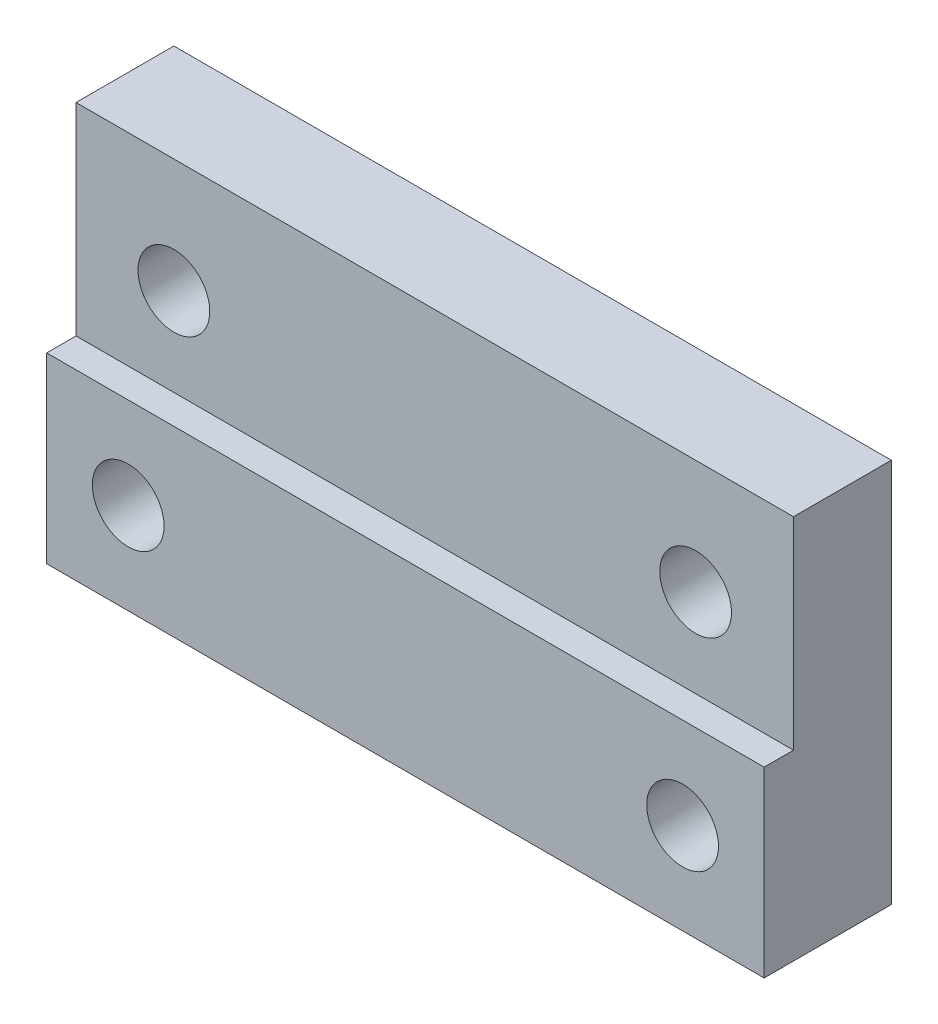
ISO-10303-21;
HEADER;
FILE_DESCRIPTION(('STEP AP214'),'2;1');
FILE_NAME('part.step','',(''),(''),'','','');
FILE_SCHEMA(('AUTOMOTIVE_DESIGN { 1 0 10303 214 1 1 1 1 }'));
ENDSEC;
DATA;
#1=APPLICATION_CONTEXT('core data for automotive mechanical design processes');
#2=APPLICATION_PROTOCOL_DEFINITION('international standard','automotive_design',2000,#1);
#3=PRODUCT_CONTEXT('',#1,'mechanical');
#4=PRODUCT('Part','Part','',(#3));
#5=PRODUCT_RELATED_PRODUCT_CATEGORY('part','',(#4));
#6=PRODUCT_DEFINITION_FORMATION('','',#4);
#7=PRODUCT_DEFINITION_CONTEXT('part definition',#1,'design');
#8=PRODUCT_DEFINITION('design','',#6,#7);
#9=PRODUCT_DEFINITION_SHAPE('','',#8);
#10=(LENGTH_UNIT() NAMED_UNIT(*) SI_UNIT(.MILLI.,.METRE.));
#11=(NAMED_UNIT(*) PLANE_ANGLE_UNIT() SI_UNIT($,.RADIAN.));
#12=(NAMED_UNIT(*) SI_UNIT($,.STERADIAN.) SOLID_ANGLE_UNIT());
#13=UNCERTAINTY_MEASURE_WITH_UNIT(LENGTH_MEASURE(1.E-05),#10,'distance_accuracy_value','');
#14=(GEOMETRIC_REPRESENTATION_CONTEXT(3) GLOBAL_UNCERTAINTY_ASSIGNED_CONTEXT((#13)) GLOBAL_UNIT_ASSIGNED_CONTEXT((#10,
#11,#12)) REPRESENTATION_CONTEXT('',''));
#15=CARTESIAN_POINT('',(0.,0.,0.));
#16=DIRECTION('',(0.,0.,1.));
#17=DIRECTION('',(1.,0.,0.));
#18=AXIS2_PLACEMENT_3D('',#15,#16,#17);
#19=CARTESIAN_POINT('',(0.,11.8,-1.95));
#20=DIRECTION('',(0.,0.,1.));
#21=DIRECTION('',(1.,0.,0.));
#22=AXIS2_PLACEMENT_3D('',#19,#20,#21);
#23=PLANE('',#22);
#24=CARTESIAN_POINT('',(-8.5,2.8,-1.95));
#25=DIRECTION('',(0.,0.,1.));
#26=DIRECTION('',(1.,0.,0.));
#27=AXIS2_PLACEMENT_3D('',#24,#25,#26);
#28=CIRCLE('',#27,1.1);
#29=CARTESIAN_POINT('',(-7.4,2.8,-1.95));
#30=VERTEX_POINT('',#29);
#31=EDGE_CURVE('E183',#30,#30,#28,.T.);
#32=ORIENTED_EDGE('',*,*,#31,.T.);
#33=EDGE_LOOP('',(#32));
#34=FACE_BOUND('',#33,.T.);
#35=CARTESIAN_POINT('',(-8.,8.3,-1.95));
#36=DIRECTION('',(0.,0.,1.));
#37=DIRECTION('',(1.,0.,0.));
#38=AXIS2_PLACEMENT_3D('',#35,#36,#37);
#39=CIRCLE('',#38,1.1);
#40=CARTESIAN_POINT('',(-6.9,8.3,-1.95));
#41=VERTEX_POINT('',#40);
#42=EDGE_CURVE('E187',#41,#41,#39,.T.);
#43=ORIENTED_EDGE('',*,*,#42,.T.);
#44=EDGE_LOOP('',(#43));
#45=FACE_BOUND('',#44,.T.);
#46=CARTESIAN_POINT('',(8.5,2.8,-1.95));
#47=DIRECTION('',(0.,0.,-1.));
#48=DIRECTION('',(-1.,0.,0.));
#49=AXIS2_PLACEMENT_3D('',#46,#47,#48);
#50=CIRCLE('',#49,1.1);
#51=CARTESIAN_POINT('',(7.4,2.8,-1.95));
#52=VERTEX_POINT('',#51);
#53=EDGE_CURVE('E128',#52,#52,#50,.T.);
#54=ORIENTED_EDGE('',*,*,#53,.F.);
#55=EDGE_LOOP('',(#54));
#56=FACE_BOUND('',#55,.T.);
#57=CARTESIAN_POINT('',(8.,8.3,-1.95));
#58=DIRECTION('',(0.,0.,-1.));
#59=DIRECTION('',(-1.,0.,0.));
#60=AXIS2_PLACEMENT_3D('',#57,#58,#59);
#61=CIRCLE('',#60,1.1);
#62=CARTESIAN_POINT('',(6.9,8.3,-1.95));
#63=VERTEX_POINT('',#62);
#64=EDGE_CURVE('E133',#63,#63,#61,.T.);
#65=ORIENTED_EDGE('',*,*,#64,.F.);
#66=EDGE_LOOP('',(#65));
#67=FACE_BOUND('',#66,.T.);
#68=DIRECTION('',(-1.,0.,0.));
#69=VECTOR('',#68,1.);
#70=CARTESIAN_POINT('',(0.,0.,-1.95));
#71=LINE('',#70,#69);
#72=CARTESIAN_POINT('',(11.,0.,-1.95));
#73=VERTEX_POINT('',#72);
#74=CARTESIAN_POINT('',(-11.,0.,-1.95));
#75=VERTEX_POINT('',#74);
#76=EDGE_CURVE('E145',#73,#75,#71,.T.);
#77=ORIENTED_EDGE('',*,*,#76,.T.);
#78=DIRECTION('',(0.,-1.,0.));
#79=VECTOR('',#78,1.);
#80=CARTESIAN_POINT('',(-11.,11.8,-1.95));
#81=LINE('',#80,#79);
#82=CARTESIAN_POINT('',(-11.,11.8,-1.95));
#83=VERTEX_POINT('',#82);
#84=EDGE_CURVE('E11',#83,#75,#81,.T.);
#85=ORIENTED_EDGE('',*,*,#84,.F.);
#86=DIRECTION('',(-1.,0.,0.));
#87=VECTOR('',#86,1.);
#88=CARTESIAN_POINT('',(0.,11.8,-1.95));
#89=LINE('',#88,#87);
#90=CARTESIAN_POINT('',(11.,11.8,-1.95));
#91=VERTEX_POINT('',#90);
#92=EDGE_CURVE('E146',#91,#83,#89,.T.);
#93=ORIENTED_EDGE('',*,*,#92,.F.);
#94=DIRECTION('',(0.,-1.,0.));
#95=VECTOR('',#94,1.);
#96=CARTESIAN_POINT('',(11.,11.8,-1.95));
#97=LINE('',#96,#95);
#98=EDGE_CURVE('E61',#91,#73,#97,.T.);
#99=ORIENTED_EDGE('',*,*,#98,.T.);
#100=EDGE_LOOP('',(#77,#85,#93,#99));
#101=FACE_BOUND('',#100,.T.);
#102=ADVANCED_FACE('F36',(#34,#45,#56,#67,#101),#23,.F.);
#103=CARTESIAN_POINT('',(-11.,11.8,0.));
#104=DIRECTION('',(1.,0.,0.));
#105=DIRECTION('',(0.,0.,-1.));
#106=AXIS2_PLACEMENT_3D('',#103,#104,#105);
#107=PLANE('',#106);
#108=DIRECTION('',(0.,0.,1.));
#109=VECTOR('',#108,1.);
#110=CARTESIAN_POINT('',(-11.,0.,0.));
#111=LINE('',#110,#109);
#112=CARTESIAN_POINT('',(-11.,0.,1.95));
#113=VERTEX_POINT('',#112);
#114=EDGE_CURVE('E154',#75,#113,#111,.T.);
#115=ORIENTED_EDGE('',*,*,#114,.T.);
#116=DIRECTION('',(0.,-1.,0.));
#117=VECTOR('',#116,1.);
#118=CARTESIAN_POINT('',(-11.,5.6,1.95));
#119=LINE('',#118,#117);
#120=CARTESIAN_POINT('',(-11.,5.6,1.95));
#121=VERTEX_POINT('',#120);
#122=EDGE_CURVE('E103',#121,#113,#119,.T.);
#123=ORIENTED_EDGE('',*,*,#122,.F.);
#124=DIRECTION('',(0.,0.,1.));
#125=VECTOR('',#124,1.);
#126=CARTESIAN_POINT('',(-11.,5.6,0.));
#127=LINE('',#126,#125);
#128=CARTESIAN_POINT('',(-11.,5.6,1.05));
#129=VERTEX_POINT('',#128);
#130=EDGE_CURVE('E98',#129,#121,#127,.T.);
#131=ORIENTED_EDGE('',*,*,#130,.F.);
#132=DIRECTION('',(0.,-1.,0.));
#133=VECTOR('',#132,1.);
#134=CARTESIAN_POINT('',(-11.,11.8,1.05));
#135=LINE('',#134,#133);
#136=CARTESIAN_POINT('',(-11.,11.8,1.05));
#137=VERTEX_POINT('',#136);
#138=EDGE_CURVE('E44',#137,#129,#135,.T.);
#139=ORIENTED_EDGE('',*,*,#138,.F.);
#140=DIRECTION('',(0.,0.,1.));
#141=VECTOR('',#140,1.);
#142=CARTESIAN_POINT('',(-11.,11.8,0.));
#143=LINE('',#142,#141);
#144=EDGE_CURVE('E81',#83,#137,#143,.T.);
#145=ORIENTED_EDGE('',*,*,#144,.F.);
#146=ORIENTED_EDGE('',*,*,#84,.T.);
#147=EDGE_LOOP('',(#115,#123,#131,#139,#145,#146));
#148=FACE_BOUND('',#147,.T.);
#149=ADVANCED_FACE('F99',(#148),#107,.F.);
#150=CARTESIAN_POINT('',(0.,11.8,1.05));
#151=DIRECTION('',(0.,0.,-1.));
#152=DIRECTION('',(-1.,0.,0.));
#153=AXIS2_PLACEMENT_3D('',#150,#151,#152);
#154=PLANE('',#153);
#155=CARTESIAN_POINT('',(-8.,8.3,1.05));
#156=DIRECTION('',(0.,0.,-1.));
#157=DIRECTION('',(-1.,0.,0.));
#158=AXIS2_PLACEMENT_3D('',#155,#156,#157);
#159=CIRCLE('',#158,1.1);
#160=CARTESIAN_POINT('',(-9.1,8.3,1.05));
#161=VERTEX_POINT('',#160);
#162=EDGE_CURVE('E39',#161,#161,#159,.F.);
#163=ORIENTED_EDGE('',*,*,#162,.F.);
#164=EDGE_LOOP('',(#163));
#165=FACE_BOUND('',#164,.T.);
#166=CARTESIAN_POINT('',(8.,8.3,1.05));
#167=DIRECTION('',(0.,0.,-1.));
#168=DIRECTION('',(-1.,0.,0.));
#169=AXIS2_PLACEMENT_3D('',#166,#167,#168);
#170=CIRCLE('',#169,1.1);
#171=CARTESIAN_POINT('',(6.9,8.3,1.05));
#172=VERTEX_POINT('',#171);
#173=EDGE_CURVE('E120',#172,#172,#170,.T.);
#174=ORIENTED_EDGE('',*,*,#173,.T.);
#175=EDGE_LOOP('',(#174));
#176=FACE_BOUND('',#175,.T.);
#177=ORIENTED_EDGE('',*,*,#138,.T.);
#178=DIRECTION('',(1.,0.,0.));
#179=VECTOR('',#178,1.);
#180=CARTESIAN_POINT('',(0.,5.6,1.05));
#181=LINE('',#180,#179);
#182=CARTESIAN_POINT('',(11.,5.6,1.05));
#183=VERTEX_POINT('',#182);
#184=EDGE_CURVE('E106',#129,#183,#181,.T.);
#185=ORIENTED_EDGE('',*,*,#184,.T.);
#186=DIRECTION('',(0.,-1.,0.));
#187=VECTOR('',#186,1.);
#188=CARTESIAN_POINT('',(11.,11.8,1.05));
#189=LINE('',#188,#187);
#190=CARTESIAN_POINT('',(11.,11.8,1.05));
#191=VERTEX_POINT('',#190);
#192=EDGE_CURVE('E116',#191,#183,#189,.T.);
#193=ORIENTED_EDGE('',*,*,#192,.F.);
#194=DIRECTION('',(1.,0.,0.));
#195=VECTOR('',#194,1.);
#196=CARTESIAN_POINT('',(0.,11.8,1.05));
#197=LINE('',#196,#195);
#198=EDGE_CURVE('E115',#137,#191,#197,.T.);
#199=ORIENTED_EDGE('',*,*,#198,.F.);
#200=EDGE_LOOP('',(#177,#185,#193,#199));
#201=FACE_BOUND('',#200,.T.);
#202=ADVANCED_FACE('F114',(#165,#176,#201),#154,.F.);
#203=CARTESIAN_POINT('',(11.,11.8,0.));
#204=DIRECTION('',(1.,0.,0.));
#205=DIRECTION('',(0.,0.,-1.));
#206=AXIS2_PLACEMENT_3D('',#203,#204,#205);
#207=PLANE('',#206);
#208=DIRECTION('',(0.,0.,1.));
#209=VECTOR('',#208,1.);
#210=CARTESIAN_POINT('',(11.,0.,0.));
#211=LINE('',#210,#209);
#212=CARTESIAN_POINT('',(11.,0.,1.95));
#213=VERTEX_POINT('',#212);
#214=EDGE_CURVE('E148',#73,#213,#211,.T.);
#215=ORIENTED_EDGE('',*,*,#214,.F.);
#216=ORIENTED_EDGE('',*,*,#98,.F.);
#217=DIRECTION('',(0.,0.,1.));
#218=VECTOR('',#217,1.);
#219=CARTESIAN_POINT('',(11.,11.8,0.));
#220=LINE('',#219,#218);
#221=EDGE_CURVE('E151',#91,#191,#220,.T.);
#222=ORIENTED_EDGE('',*,*,#221,.T.);
#223=ORIENTED_EDGE('',*,*,#192,.T.);
#224=DIRECTION('',(0.,0.,1.));
#225=VECTOR('',#224,1.);
#226=CARTESIAN_POINT('',(11.,5.6,0.));
#227=LINE('',#226,#225);
#228=CARTESIAN_POINT('',(11.,5.6,1.95));
#229=VERTEX_POINT('',#228);
#230=EDGE_CURVE('E52',#183,#229,#227,.T.);
#231=ORIENTED_EDGE('',*,*,#230,.T.);
#232=DIRECTION('',(0.,-1.,0.));
#233=VECTOR('',#232,1.);
#234=CARTESIAN_POINT('',(11.,5.6,1.95));
#235=LINE('',#234,#233);
#236=EDGE_CURVE('E140',#229,#213,#235,.T.);
#237=ORIENTED_EDGE('',*,*,#236,.T.);
#238=EDGE_LOOP('',(#215,#216,#222,#223,#231,#237));
#239=FACE_BOUND('',#238,.T.);
#240=ADVANCED_FACE('F159',(#239),#207,.T.);
#241=CARTESIAN_POINT('',(0.,11.8,0.));
#242=DIRECTION('',(0.,1.,0.));
#243=DIRECTION('',(0.,0.,1.));
#244=AXIS2_PLACEMENT_3D('',#241,#242,#243);
#245=PLANE('',#244);
#246=ORIENTED_EDGE('',*,*,#92,.T.);
#247=ORIENTED_EDGE('',*,*,#144,.T.);
#248=ORIENTED_EDGE('',*,*,#198,.T.);
#249=ORIENTED_EDGE('',*,*,#221,.F.);
#250=EDGE_LOOP('',(#246,#247,#248,#249));
#251=FACE_BOUND('',#250,.T.);
#252=ADVANCED_FACE('F171',(#251),#245,.T.);
#253=CARTESIAN_POINT('',(0.,0.,0.));
#254=DIRECTION('',(0.,1.,0.));
#255=DIRECTION('',(0.,0.,1.));
#256=AXIS2_PLACEMENT_3D('',#253,#254,#255);
#257=PLANE('',#256);
#258=ORIENTED_EDGE('',*,*,#76,.F.);
#259=ORIENTED_EDGE('',*,*,#214,.T.);
#260=DIRECTION('',(-1.,0.,0.));
#261=VECTOR('',#260,1.);
#262=CARTESIAN_POINT('',(0.,0.,1.95));
#263=LINE('',#262,#261);
#264=EDGE_CURVE('E112',#213,#113,#263,.T.);
#265=ORIENTED_EDGE('',*,*,#264,.T.);
#266=ORIENTED_EDGE('',*,*,#114,.F.);
#267=EDGE_LOOP('',(#258,#259,#265,#266));
#268=FACE_BOUND('',#267,.T.);
#269=ADVANCED_FACE('F157',(#268),#257,.F.);
#270=CARTESIAN_POINT('',(0.,5.6,1.95));
#271=DIRECTION('',(0.,0.,1.));
#272=DIRECTION('',(1.,0.,0.));
#273=AXIS2_PLACEMENT_3D('',#270,#271,#272);
#274=PLANE('',#273);
#275=CARTESIAN_POINT('',(-8.5,2.8,1.95));
#276=DIRECTION('',(0.,0.,1.));
#277=DIRECTION('',(1.,0.,0.));
#278=AXIS2_PLACEMENT_3D('',#275,#276,#277);
#279=CIRCLE('',#278,1.1);
#280=CARTESIAN_POINT('',(-7.4,2.8,1.95));
#281=VERTEX_POINT('',#280);
#282=EDGE_CURVE('E207',#281,#281,#279,.T.);
#283=ORIENTED_EDGE('',*,*,#282,.F.);
#284=EDGE_LOOP('',(#283));
#285=FACE_BOUND('',#284,.T.);
#286=CARTESIAN_POINT('',(8.5,2.8,1.95));
#287=DIRECTION('',(0.,0.,1.));
#288=DIRECTION('',(1.,0.,0.));
#289=AXIS2_PLACEMENT_3D('',#286,#287,#288);
#290=CIRCLE('',#289,1.1);
#291=CARTESIAN_POINT('',(9.6,2.8,1.95));
#292=VERTEX_POINT('',#291);
#293=EDGE_CURVE('E122',#292,#292,#290,.F.);
#294=ORIENTED_EDGE('',*,*,#293,.T.);
#295=EDGE_LOOP('',(#294));
#296=FACE_BOUND('',#295,.T.);
#297=ORIENTED_EDGE('',*,*,#264,.F.);
#298=ORIENTED_EDGE('',*,*,#236,.F.);
#299=DIRECTION('',(-1.,0.,0.));
#300=VECTOR('',#299,1.);
#301=CARTESIAN_POINT('',(0.,5.6,1.95));
#302=LINE('',#301,#300);
#303=EDGE_CURVE('E105',#229,#121,#302,.T.);
#304=ORIENTED_EDGE('',*,*,#303,.T.);
#305=ORIENTED_EDGE('',*,*,#122,.T.);
#306=EDGE_LOOP('',(#297,#298,#304,#305));
#307=FACE_BOUND('',#306,.T.);
#308=ADVANCED_FACE('F161',(#285,#296,#307),#274,.T.);
#309=CARTESIAN_POINT('',(0.,5.6,0.));
#310=DIRECTION('',(0.,1.,0.));
#311=DIRECTION('',(0.,0.,1.));
#312=AXIS2_PLACEMENT_3D('',#309,#310,#311);
#313=PLANE('',#312);
#314=ORIENTED_EDGE('',*,*,#184,.F.);
#315=ORIENTED_EDGE('',*,*,#130,.T.);
#316=ORIENTED_EDGE('',*,*,#303,.F.);
#317=ORIENTED_EDGE('',*,*,#230,.F.);
#318=EDGE_LOOP('',(#314,#315,#316,#317));
#319=FACE_BOUND('',#318,.T.);
#320=ADVANCED_FACE('F108',(#319),#313,.T.);
#321=CARTESIAN_POINT('',(8.5,2.8,5.06126983722081));
#322=DIRECTION('',(0.,0.,-1.));
#323=DIRECTION('',(-1.,0.,0.));
#324=AXIS2_PLACEMENT_3D('',#321,#322,#323);
#325=CYLINDRICAL_SURFACE('',#324,1.1);
#326=ORIENTED_EDGE('',*,*,#53,.T.);
#327=EDGE_LOOP('',(#326));
#328=FACE_BOUND('',#327,.T.);
#329=ORIENTED_EDGE('',*,*,#293,.F.);
#330=EDGE_LOOP('',(#329));
#331=FACE_BOUND('',#330,.T.);
#332=ADVANCED_FACE('F169',(#328,#331),#325,.F.);
#333=CARTESIAN_POINT('',(8.,8.3,5.06126983722081));
#334=DIRECTION('',(0.,0.,-1.));
#335=DIRECTION('',(-1.,0.,0.));
#336=AXIS2_PLACEMENT_3D('',#333,#334,#335);
#337=CYLINDRICAL_SURFACE('',#336,1.1);
#338=ORIENTED_EDGE('',*,*,#64,.T.);
#339=EDGE_LOOP('',(#338));
#340=FACE_BOUND('',#339,.T.);
#341=ORIENTED_EDGE('',*,*,#173,.F.);
#342=EDGE_LOOP('',(#341));
#343=FACE_BOUND('',#342,.T.);
#344=ADVANCED_FACE('F215',(#340,#343),#337,.F.);
#345=CARTESIAN_POINT('',(-8.5,2.8,5.06126983722081));
#346=DIRECTION('',(0.,0.,-1.));
#347=DIRECTION('',(-1.,0.,0.));
#348=AXIS2_PLACEMENT_3D('',#345,#346,#347);
#349=CYLINDRICAL_SURFACE('',#348,1.1);
#350=ORIENTED_EDGE('',*,*,#31,.F.);
#351=EDGE_LOOP('',(#350));
#352=FACE_BOUND('',#351,.T.);
#353=ORIENTED_EDGE('',*,*,#282,.T.);
#354=EDGE_LOOP('',(#353));
#355=FACE_BOUND('',#354,.T.);
#356=ADVANCED_FACE('F212',(#352,#355),#349,.F.);
#357=CARTESIAN_POINT('',(-8.,8.3,5.06126983722081));
#358=DIRECTION('',(0.,0.,-1.));
#359=DIRECTION('',(-1.,0.,0.));
#360=AXIS2_PLACEMENT_3D('',#357,#358,#359);
#361=CYLINDRICAL_SURFACE('',#360,1.1);
#362=ORIENTED_EDGE('',*,*,#42,.F.);
#363=EDGE_LOOP('',(#362));
#364=FACE_BOUND('',#363,.T.);
#365=ORIENTED_EDGE('',*,*,#162,.T.);
#366=EDGE_LOOP('',(#365));
#367=FACE_BOUND('',#366,.T.);
#368=ADVANCED_FACE('F214',(#364,#367),#361,.F.);
#369=CLOSED_SHELL('',(#102,#149,#202,#240,#252,#269,#308,#320,#332,#344,#356,#368));
#370=MANIFOLD_SOLID_BREP('B2',#369);
#371=ADVANCED_BREP_SHAPE_REPRESENTATION('',(#18,#370),#14);
#372=SHAPE_DEFINITION_REPRESENTATION(#9,#371);
ENDSEC;
END-ISO-10303-21;
